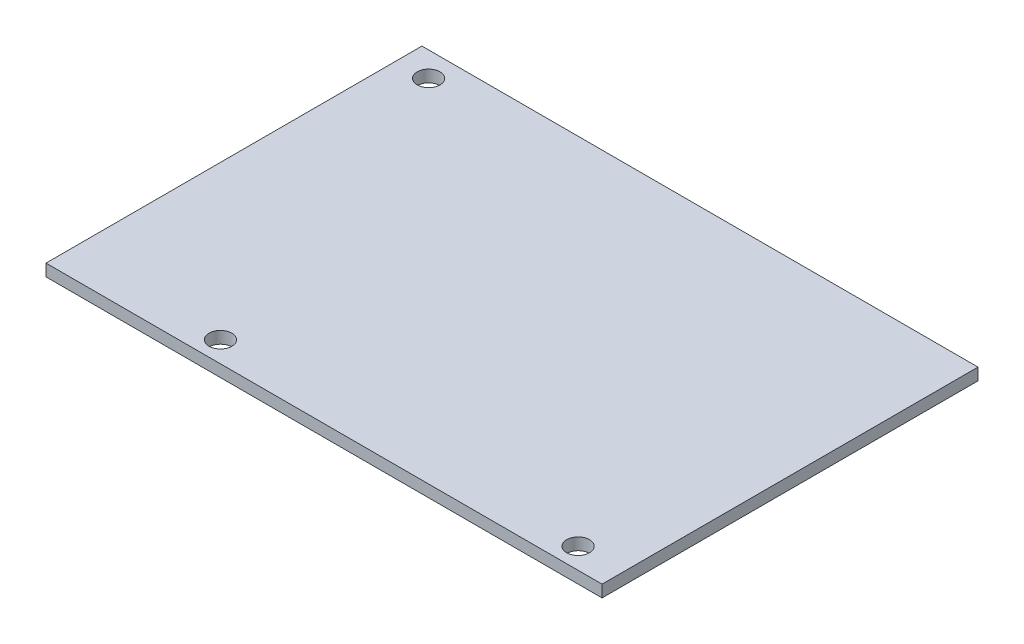
ISO-10303-21;
HEADER;
FILE_DESCRIPTION(('STEP AP214'),'2;1');
FILE_NAME('part.step','',(''),(''),'','','');
FILE_SCHEMA(('AUTOMOTIVE_DESIGN { 1 0 10303 214 1 1 1 1 }'));
ENDSEC;
DATA;
#1=APPLICATION_CONTEXT('core data for automotive mechanical design processes');
#2=APPLICATION_PROTOCOL_DEFINITION('international standard','automotive_design',2000,#1);
#3=PRODUCT_CONTEXT('',#1,'mechanical');
#4=PRODUCT('Part','Part','',(#3));
#5=PRODUCT_RELATED_PRODUCT_CATEGORY('part','',(#4));
#6=PRODUCT_DEFINITION_FORMATION('','',#4);
#7=PRODUCT_DEFINITION_CONTEXT('part definition',#1,'design');
#8=PRODUCT_DEFINITION('design','',#6,#7);
#9=PRODUCT_DEFINITION_SHAPE('','',#8);
#10=(LENGTH_UNIT() NAMED_UNIT(*) SI_UNIT(.MILLI.,.METRE.));
#11=(NAMED_UNIT(*) PLANE_ANGLE_UNIT() SI_UNIT($,.RADIAN.));
#12=(NAMED_UNIT(*) SI_UNIT($,.STERADIAN.) SOLID_ANGLE_UNIT());
#13=UNCERTAINTY_MEASURE_WITH_UNIT(LENGTH_MEASURE(1.E-05),#10,'distance_accuracy_value','');
#14=(GEOMETRIC_REPRESENTATION_CONTEXT(3) GLOBAL_UNCERTAINTY_ASSIGNED_CONTEXT((#13)) GLOBAL_UNIT_ASSIGNED_CONTEXT((#10,
#11,#12)) REPRESENTATION_CONTEXT('',''));
#15=CARTESIAN_POINT('',(0.,0.,0.));
#16=DIRECTION('',(0.,0.,1.));
#17=DIRECTION('',(1.,0.,0.));
#18=AXIS2_PLACEMENT_3D('',#15,#16,#17);
#19=CARTESIAN_POINT('',(0.,1.6,0.));
#20=DIRECTION('',(1.,0.,0.));
#21=DIRECTION('',(0.,0.,-1.));
#22=AXIS2_PLACEMENT_3D('',#19,#20,#21);
#23=PLANE('',#22);
#24=DIRECTION('',(0.,0.,1.));
#25=VECTOR('',#24,1.);
#26=CARTESIAN_POINT('',(0.,0.,0.));
#27=LINE('',#26,#25);
#28=CARTESIAN_POINT('',(0.,0.,-50.3));
#29=VERTEX_POINT('',#28);
#30=CARTESIAN_POINT('',(0.,0.,0.));
#31=VERTEX_POINT('',#30);
#32=EDGE_CURVE('E97',#29,#31,#27,.T.);
#33=ORIENTED_EDGE('',*,*,#32,.T.);
#34=DIRECTION('',(0.,-1.,0.));
#35=VECTOR('',#34,1.);
#36=CARTESIAN_POINT('',(0.,1.6,0.));
#37=LINE('',#36,#35);
#38=CARTESIAN_POINT('',(0.,1.6,0.));
#39=VERTEX_POINT('',#38);
#40=EDGE_CURVE('E11',#39,#31,#37,.T.);
#41=ORIENTED_EDGE('',*,*,#40,.F.);
#42=DIRECTION('',(0.,0.,1.));
#43=VECTOR('',#42,1.);
#44=CARTESIAN_POINT('',(0.,1.6,0.));
#45=LINE('',#44,#43);
#46=CARTESIAN_POINT('',(0.,1.6,-50.3));
#47=VERTEX_POINT('',#46);
#48=EDGE_CURVE('E85',#47,#39,#45,.T.);
#49=ORIENTED_EDGE('',*,*,#48,.F.);
#50=DIRECTION('',(0.,-1.,0.));
#51=VECTOR('',#50,1.);
#52=CARTESIAN_POINT('',(0.,1.6,-50.3));
#53=LINE('',#52,#51);
#54=EDGE_CURVE('E93',#47,#29,#53,.T.);
#55=ORIENTED_EDGE('',*,*,#54,.T.);
#56=EDGE_LOOP('',(#33,#41,#49,#55));
#57=FACE_BOUND('',#56,.T.);
#58=ADVANCED_FACE('F34',(#57),#23,.F.);
#59=CARTESIAN_POINT('',(0.,1.6,0.));
#60=DIRECTION('',(0.,0.,-1.));
#61=DIRECTION('',(-1.,0.,0.));
#62=AXIS2_PLACEMENT_3D('',#59,#60,#61);
#63=PLANE('',#62);
#64=DIRECTION('',(1.,0.,0.));
#65=VECTOR('',#64,1.);
#66=CARTESIAN_POINT('',(0.,0.,0.));
#67=LINE('',#66,#65);
#68=CARTESIAN_POINT('',(74.4,0.,0.));
#69=VERTEX_POINT('',#68);
#70=EDGE_CURVE('E89',#31,#69,#67,.T.);
#71=ORIENTED_EDGE('',*,*,#70,.T.);
#72=DIRECTION('',(0.,-1.,0.));
#73=VECTOR('',#72,1.);
#74=CARTESIAN_POINT('',(74.4,1.6,0.));
#75=LINE('',#74,#73);
#76=CARTESIAN_POINT('',(74.4,1.6,0.));
#77=VERTEX_POINT('',#76);
#78=EDGE_CURVE('E42',#77,#69,#75,.T.);
#79=ORIENTED_EDGE('',*,*,#78,.F.);
#80=DIRECTION('',(1.,0.,0.));
#81=VECTOR('',#80,1.);
#82=CARTESIAN_POINT('',(0.,1.6,0.));
#83=LINE('',#82,#81);
#84=EDGE_CURVE('E80',#39,#77,#83,.T.);
#85=ORIENTED_EDGE('',*,*,#84,.F.);
#86=ORIENTED_EDGE('',*,*,#40,.T.);
#87=EDGE_LOOP('',(#71,#79,#85,#86));
#88=FACE_BOUND('',#87,.T.);
#89=ADVANCED_FACE('F88',(#88),#63,.F.);
#90=CARTESIAN_POINT('',(74.4,1.6,0.));
#91=DIRECTION('',(-1.,0.,0.));
#92=DIRECTION('',(0.,0.,1.));
#93=AXIS2_PLACEMENT_3D('',#90,#91,#92);
#94=PLANE('',#93);
#95=DIRECTION('',(0.,0.,-1.));
#96=VECTOR('',#95,1.);
#97=CARTESIAN_POINT('',(74.4,0.,0.));
#98=LINE('',#97,#96);
#99=CARTESIAN_POINT('',(74.4,0.,-50.3));
#100=VERTEX_POINT('',#99);
#101=EDGE_CURVE('E67',#69,#100,#98,.T.);
#102=ORIENTED_EDGE('',*,*,#101,.T.);
#103=DIRECTION('',(0.,-1.,0.));
#104=VECTOR('',#103,1.);
#105=CARTESIAN_POINT('',(74.4,1.6,-50.3));
#106=LINE('',#105,#104);
#107=CARTESIAN_POINT('',(74.4,1.6,-50.3));
#108=VERTEX_POINT('',#107);
#109=EDGE_CURVE('E90',#108,#100,#106,.T.);
#110=ORIENTED_EDGE('',*,*,#109,.F.);
#111=DIRECTION('',(0.,0.,-1.));
#112=VECTOR('',#111,1.);
#113=CARTESIAN_POINT('',(74.4,1.6,0.));
#114=LINE('',#113,#112);
#115=EDGE_CURVE('E83',#77,#108,#114,.T.);
#116=ORIENTED_EDGE('',*,*,#115,.F.);
#117=ORIENTED_EDGE('',*,*,#78,.T.);
#118=EDGE_LOOP('',(#102,#110,#116,#117));
#119=FACE_BOUND('',#118,.T.);
#120=ADVANCED_FACE('F91',(#119),#94,.F.);
#121=CARTESIAN_POINT('',(0.,1.6,-50.3));
#122=DIRECTION('',(0.,0.,1.));
#123=DIRECTION('',(1.,0.,0.));
#124=AXIS2_PLACEMENT_3D('',#121,#122,#123);
#125=PLANE('',#124);
#126=DIRECTION('',(-1.,0.,0.));
#127=VECTOR('',#126,1.);
#128=CARTESIAN_POINT('',(0.,0.,-50.3));
#129=LINE('',#128,#127);
#130=EDGE_CURVE('E73',#100,#29,#129,.T.);
#131=ORIENTED_EDGE('',*,*,#130,.T.);
#132=ORIENTED_EDGE('',*,*,#54,.F.);
#133=DIRECTION('',(-1.,0.,0.));
#134=VECTOR('',#133,1.);
#135=CARTESIAN_POINT('',(0.,1.6,-50.3));
#136=LINE('',#135,#134);
#137=EDGE_CURVE('E50',#108,#47,#136,.T.);
#138=ORIENTED_EDGE('',*,*,#137,.F.);
#139=ORIENTED_EDGE('',*,*,#109,.T.);
#140=EDGE_LOOP('',(#131,#132,#138,#139));
#141=FACE_BOUND('',#140,.T.);
#142=ADVANCED_FACE('F105',(#141),#125,.F.);
#143=CARTESIAN_POINT('',(0.,1.6,0.));
#144=DIRECTION('',(0.,-1.,0.));
#145=DIRECTION('',(0.,0.,-1.));
#146=AXIS2_PLACEMENT_3D('',#143,#144,#145);
#147=PLANE('',#146);
#148=CARTESIAN_POINT('',(4.19099999999999,1.6,-46.998));
#149=DIRECTION('',(0.,1.,0.));
#150=DIRECTION('',(0.,0.,1.));
#151=AXIS2_PLACEMENT_3D('',#148,#149,#150);
#152=CIRCLE('',#151,1.524);
#153=CARTESIAN_POINT('',(4.19099999999999,1.6,-45.474));
#154=VERTEX_POINT('',#153);
#155=EDGE_CURVE('E123',#154,#154,#152,.T.);
#156=ORIENTED_EDGE('',*,*,#155,.F.);
#157=EDGE_LOOP('',(#156));
#158=FACE_BOUND('',#157,.T.);
#159=CARTESIAN_POINT('',(68.4022,1.6,-2.794));
#160=DIRECTION('',(0.,1.,0.));
#161=DIRECTION('',(0.,0.,1.));
#162=AXIS2_PLACEMENT_3D('',#159,#160,#161);
#163=CIRCLE('',#162,1.52399999999999);
#164=CARTESIAN_POINT('',(68.4022,1.6,-1.27000000000001));
#165=VERTEX_POINT('',#164);
#166=EDGE_CURVE('E117',#165,#165,#163,.T.);
#167=ORIENTED_EDGE('',*,*,#166,.F.);
#168=EDGE_LOOP('',(#167));
#169=FACE_BOUND('',#168,.T.);
#170=CARTESIAN_POINT('',(20.5486,1.6,-2.794));
#171=DIRECTION('',(0.,1.,0.));
#172=DIRECTION('',(0.,0.,1.));
#173=AXIS2_PLACEMENT_3D('',#170,#171,#172);
#174=CIRCLE('',#173,1.524);
#175=CARTESIAN_POINT('',(20.5486,1.6,-1.27));
#176=VERTEX_POINT('',#175);
#177=EDGE_CURVE('E111',#176,#176,#174,.T.);
#178=ORIENTED_EDGE('',*,*,#177,.F.);
#179=EDGE_LOOP('',(#178));
#180=FACE_BOUND('',#179,.T.);
#181=ORIENTED_EDGE('',*,*,#48,.T.);
#182=ORIENTED_EDGE('',*,*,#84,.T.);
#183=ORIENTED_EDGE('',*,*,#115,.T.);
#184=ORIENTED_EDGE('',*,*,#137,.T.);
#185=EDGE_LOOP('',(#181,#182,#183,#184));
#186=FACE_BOUND('',#185,.T.);
#187=ADVANCED_FACE('F81',(#158,#169,#180,#186),#147,.F.);
#188=CARTESIAN_POINT('',(0.,0.,0.));
#189=DIRECTION('',(0.,-1.,0.));
#190=DIRECTION('',(0.,0.,-1.));
#191=AXIS2_PLACEMENT_3D('',#188,#189,#190);
#192=PLANE('',#191);
#193=CARTESIAN_POINT('',(4.19099999999999,0.,-46.998));
#194=DIRECTION('',(0.,1.,0.));
#195=DIRECTION('',(0.,0.,1.));
#196=AXIS2_PLACEMENT_3D('',#193,#194,#195);
#197=CIRCLE('',#196,1.524);
#198=CARTESIAN_POINT('',(4.19099999999999,0.,-45.474));
#199=VERTEX_POINT('',#198);
#200=EDGE_CURVE('E120',#199,#199,#197,.T.);
#201=ORIENTED_EDGE('',*,*,#200,.T.);
#202=EDGE_LOOP('',(#201));
#203=FACE_BOUND('',#202,.T.);
#204=CARTESIAN_POINT('',(68.4022,0.,-2.794));
#205=DIRECTION('',(0.,1.,0.));
#206=DIRECTION('',(0.,0.,1.));
#207=AXIS2_PLACEMENT_3D('',#204,#205,#206);
#208=CIRCLE('',#207,1.52399999999999);
#209=CARTESIAN_POINT('',(68.4022,0.,-1.27000000000001));
#210=VERTEX_POINT('',#209);
#211=EDGE_CURVE('E114',#210,#210,#208,.T.);
#212=ORIENTED_EDGE('',*,*,#211,.T.);
#213=EDGE_LOOP('',(#212));
#214=FACE_BOUND('',#213,.T.);
#215=CARTESIAN_POINT('',(20.5486,0.,-2.794));
#216=DIRECTION('',(0.,1.,0.));
#217=DIRECTION('',(0.,0.,1.));
#218=AXIS2_PLACEMENT_3D('',#215,#216,#217);
#219=CIRCLE('',#218,1.524);
#220=CARTESIAN_POINT('',(20.5486,0.,-1.27));
#221=VERTEX_POINT('',#220);
#222=EDGE_CURVE('E100',#221,#221,#219,.T.);
#223=ORIENTED_EDGE('',*,*,#222,.T.);
#224=EDGE_LOOP('',(#223));
#225=FACE_BOUND('',#224,.T.);
#226=ORIENTED_EDGE('',*,*,#32,.F.);
#227=ORIENTED_EDGE('',*,*,#130,.F.);
#228=ORIENTED_EDGE('',*,*,#101,.F.);
#229=ORIENTED_EDGE('',*,*,#70,.F.);
#230=EDGE_LOOP('',(#226,#227,#228,#229));
#231=FACE_BOUND('',#230,.T.);
#232=ADVANCED_FACE('F108',(#203,#214,#225,#231),#192,.T.);
#233=CARTESIAN_POINT('',(20.5486,0.,-2.794));
#234=DIRECTION('',(0.,1.,0.));
#235=DIRECTION('',(0.,0.,1.));
#236=AXIS2_PLACEMENT_3D('',#233,#234,#235);
#237=CYLINDRICAL_SURFACE('',#236,1.524);
#238=ORIENTED_EDGE('',*,*,#222,.F.);
#239=EDGE_LOOP('',(#238));
#240=FACE_BOUND('',#239,.T.);
#241=ORIENTED_EDGE('',*,*,#177,.T.);
#242=EDGE_LOOP('',(#241));
#243=FACE_BOUND('',#242,.T.);
#244=ADVANCED_FACE('F145',(#240,#243),#237,.F.);
#245=CARTESIAN_POINT('',(68.4022,0.,-2.794));
#246=DIRECTION('',(0.,1.,0.));
#247=DIRECTION('',(0.,0.,1.));
#248=AXIS2_PLACEMENT_3D('',#245,#246,#247);
#249=CYLINDRICAL_SURFACE('',#248,1.52399999999999);
#250=ORIENTED_EDGE('',*,*,#211,.F.);
#251=EDGE_LOOP('',(#250));
#252=FACE_BOUND('',#251,.T.);
#253=ORIENTED_EDGE('',*,*,#166,.T.);
#254=EDGE_LOOP('',(#253));
#255=FACE_BOUND('',#254,.T.);
#256=ADVANCED_FACE('F134',(#252,#255),#249,.F.);
#257=CARTESIAN_POINT('',(4.19099999999999,0.,-46.998));
#258=DIRECTION('',(0.,1.,0.));
#259=DIRECTION('',(0.,0.,1.));
#260=AXIS2_PLACEMENT_3D('',#257,#258,#259);
#261=CYLINDRICAL_SURFACE('',#260,1.524);
#262=ORIENTED_EDGE('',*,*,#200,.F.);
#263=EDGE_LOOP('',(#262));
#264=FACE_BOUND('',#263,.T.);
#265=ORIENTED_EDGE('',*,*,#155,.T.);
#266=EDGE_LOOP('',(#265));
#267=FACE_BOUND('',#266,.T.);
#268=ADVANCED_FACE('F131',(#264,#267),#261,.F.);
#269=CLOSED_SHELL('',(#58,#89,#120,#142,#187,#232,#244,#256,#268));
#270=MANIFOLD_SOLID_BREP('B2',#269);
#271=ADVANCED_BREP_SHAPE_REPRESENTATION('',(#18,#270),#14);
#272=SHAPE_DEFINITION_REPRESENTATION(#9,#271);
ENDSEC;
END-ISO-10303-21;
